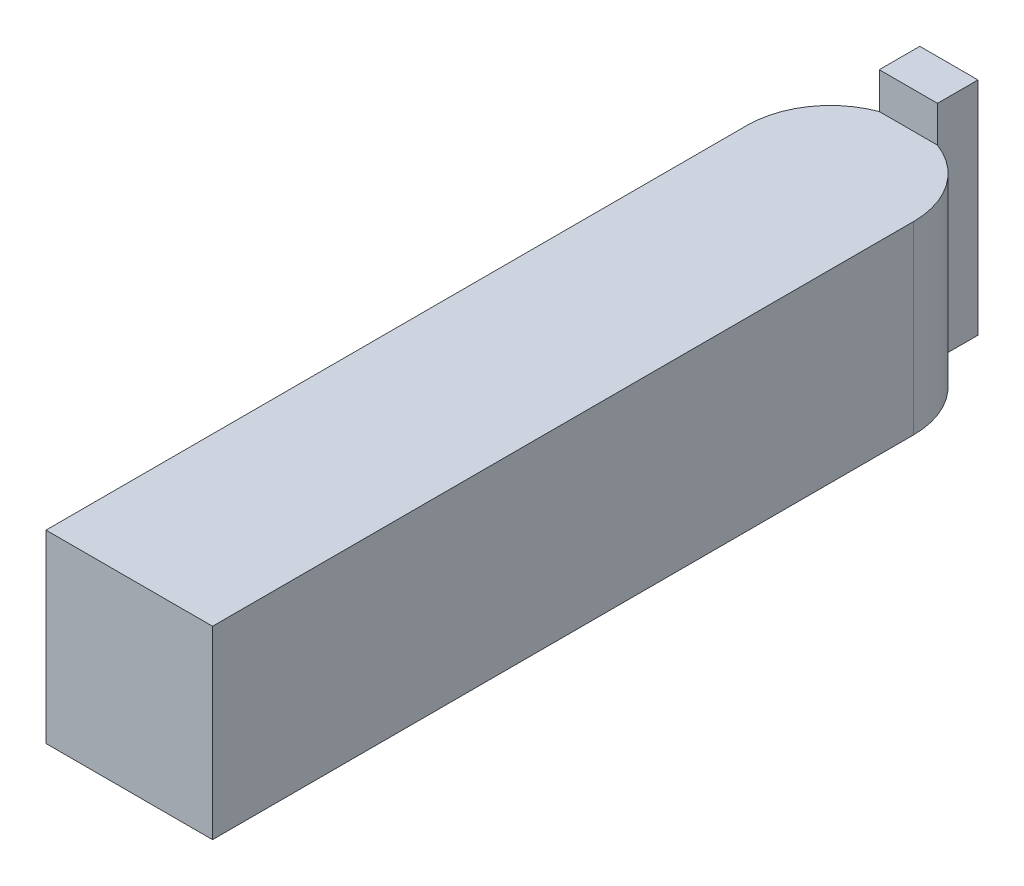
ISO-10303-21;
HEADER;
FILE_DESCRIPTION(('STEP AP214'),'2;1');
FILE_NAME('part.step','',(''),(''),'','','');
FILE_SCHEMA(('AUTOMOTIVE_DESIGN { 1 0 10303 214 1 1 1 1 }'));
ENDSEC;
DATA;
#1=APPLICATION_CONTEXT('core data for automotive mechanical design processes');
#2=APPLICATION_PROTOCOL_DEFINITION('international standard','automotive_design',2000,#1);
#3=PRODUCT_CONTEXT('',#1,'mechanical');
#4=PRODUCT('Part','Part','',(#3));
#5=PRODUCT_RELATED_PRODUCT_CATEGORY('part','',(#4));
#6=PRODUCT_DEFINITION_FORMATION('','',#4);
#7=PRODUCT_DEFINITION_CONTEXT('part definition',#1,'design');
#8=PRODUCT_DEFINITION('design','',#6,#7);
#9=PRODUCT_DEFINITION_SHAPE('','',#8);
#10=(LENGTH_UNIT() NAMED_UNIT(*) SI_UNIT(.MILLI.,.METRE.));
#11=(NAMED_UNIT(*) PLANE_ANGLE_UNIT() SI_UNIT($,.RADIAN.));
#12=(NAMED_UNIT(*) SI_UNIT($,.STERADIAN.) SOLID_ANGLE_UNIT());
#13=UNCERTAINTY_MEASURE_WITH_UNIT(LENGTH_MEASURE(1.E-05),#10,'distance_accuracy_value','');
#14=(GEOMETRIC_REPRESENTATION_CONTEXT(3) GLOBAL_UNCERTAINTY_ASSIGNED_CONTEXT((#13)) GLOBAL_UNIT_ASSIGNED_CONTEXT((#10,
#11,#12)) REPRESENTATION_CONTEXT('',''));
#15=CARTESIAN_POINT('',(0.,0.,0.));
#16=DIRECTION('',(0.,0.,1.));
#17=DIRECTION('',(1.,0.,0.));
#18=AXIS2_PLACEMENT_3D('',#15,#16,#17);
#19=CARTESIAN_POINT('',(0.,36.5125,-69.245));
#20=DIRECTION('',(0.,-1.,0.));
#21=DIRECTION('',(0.,0.,-1.));
#22=AXIS2_PLACEMENT_3D('',#19,#20,#21);
#23=PLANE('',#22);
#24=DIRECTION('',(1.,0.,0.));
#25=VECTOR('',#24,1.);
#26=CARTESIAN_POINT('',(-5.75,36.5125,-84.6573327241531));
#27=LINE('',#26,#25);
#28=CARTESIAN_POINT('',(-5.75,36.5125,-84.6573327241531));
#29=VERTEX_POINT('',#28);
#30=CARTESIAN_POINT('',(5.75,36.5125,-84.6573327241531));
#31=VERTEX_POINT('',#30);
#32=EDGE_CURVE('E210',#29,#31,#27,.T.);
#33=ORIENTED_EDGE('',*,*,#32,.F.);
#34=CARTESIAN_POINT('',(0.,36.5125,-69.245));
#35=DIRECTION('',(0.,1.,0.));
#36=DIRECTION('',(0.,0.,-1.));
#37=AXIS2_PLACEMENT_3D('',#34,#35,#36);
#38=CIRCLE('',#37,16.45);
#39=CARTESIAN_POINT('',(-16.45,36.5125,-69.245));
#40=VERTEX_POINT('',#39);
#41=EDGE_CURVE('E63',#29,#40,#38,.T.);
#42=ORIENTED_EDGE('',*,*,#41,.T.);
#43=DIRECTION('',(0.,0.,1.));
#44=VECTOR('',#43,1.);
#45=CARTESIAN_POINT('',(-16.45,36.5125,69.245));
#46=LINE('',#45,#44);
#47=CARTESIAN_POINT('',(-16.45,36.5125,69.245));
#48=VERTEX_POINT('',#47);
#49=EDGE_CURVE('E167',#40,#48,#46,.T.);
#50=ORIENTED_EDGE('',*,*,#49,.T.);
#51=DIRECTION('',(1.,0.,0.));
#52=VECTOR('',#51,1.);
#53=CARTESIAN_POINT('',(-16.45,36.5125,69.245));
#54=LINE('',#53,#52);
#55=CARTESIAN_POINT('',(16.45,36.5125,69.245));
#56=VERTEX_POINT('',#55);
#57=EDGE_CURVE('E107',#48,#56,#54,.T.);
#58=ORIENTED_EDGE('',*,*,#57,.T.);
#59=DIRECTION('',(0.,0.,-1.));
#60=VECTOR('',#59,1.);
#61=CARTESIAN_POINT('',(16.45,36.5125,69.245));
#62=LINE('',#61,#60);
#63=CARTESIAN_POINT('',(16.45,36.5125,-69.245));
#64=VERTEX_POINT('',#63);
#65=EDGE_CURVE('E115',#56,#64,#62,.T.);
#66=ORIENTED_EDGE('',*,*,#65,.T.);
#67=CARTESIAN_POINT('',(0.,36.5125,-69.245));
#68=DIRECTION('',(0.,1.,0.));
#69=DIRECTION('',(0.,0.,-1.));
#70=AXIS2_PLACEMENT_3D('',#67,#68,#69);
#71=CIRCLE('',#70,16.45);
#72=EDGE_CURVE('E118',#64,#31,#71,.T.);
#73=ORIENTED_EDGE('',*,*,#72,.T.);
#74=EDGE_LOOP('',(#33,#42,#50,#58,#66,#73));
#75=FACE_BOUND('',#74,.T.);
#76=ADVANCED_FACE('F45',(#75),#23,.F.);
#77=CARTESIAN_POINT('',(-16.45,36.5125,69.245));
#78=DIRECTION('',(1.,0.,0.));
#79=DIRECTION('',(0.,0.,-1.));
#80=AXIS2_PLACEMENT_3D('',#77,#78,#79);
#81=PLANE('',#80);
#82=DIRECTION('',(0.,0.,1.));
#83=VECTOR('',#82,1.);
#84=CARTESIAN_POINT('',(-16.45,0.,69.245));
#85=LINE('',#84,#83);
#86=CARTESIAN_POINT('',(-16.45,0.,-69.245));
#87=VERTEX_POINT('',#86);
#88=CARTESIAN_POINT('',(-16.45,0.,69.245));
#89=VERTEX_POINT('',#88);
#90=EDGE_CURVE('E144',#87,#89,#85,.T.);
#91=ORIENTED_EDGE('',*,*,#90,.T.);
#92=DIRECTION('',(0.,-1.,0.));
#93=VECTOR('',#92,1.);
#94=CARTESIAN_POINT('',(-16.45,36.5125,69.245));
#95=LINE('',#94,#93);
#96=EDGE_CURVE('E11',#48,#89,#95,.T.);
#97=ORIENTED_EDGE('',*,*,#96,.F.);
#98=ORIENTED_EDGE('',*,*,#49,.F.);
#99=DIRECTION('',(0.,-1.,0.));
#100=VECTOR('',#99,1.);
#101=CARTESIAN_POINT('',(-16.45,36.5125,-69.245));
#102=LINE('',#101,#100);
#103=EDGE_CURVE('E140',#40,#87,#102,.T.);
#104=ORIENTED_EDGE('',*,*,#103,.T.);
#105=EDGE_LOOP('',(#91,#97,#98,#104));
#106=FACE_BOUND('',#105,.T.);
#107=ADVANCED_FACE('F47',(#106),#81,.F.);
#108=CARTESIAN_POINT('',(-16.45,36.5125,69.245));
#109=DIRECTION('',(0.,0.,-1.));
#110=DIRECTION('',(-1.,0.,0.));
#111=AXIS2_PLACEMENT_3D('',#108,#109,#110);
#112=PLANE('',#111);
#113=DIRECTION('',(1.,0.,0.));
#114=VECTOR('',#113,1.);
#115=CARTESIAN_POINT('',(-16.45,0.,69.245));
#116=LINE('',#115,#114);
#117=CARTESIAN_POINT('',(16.45,0.,69.245));
#118=VERTEX_POINT('',#117);
#119=EDGE_CURVE('E148',#89,#118,#116,.T.);
#120=ORIENTED_EDGE('',*,*,#119,.T.);
#121=DIRECTION('',(0.,-1.,0.));
#122=VECTOR('',#121,1.);
#123=CARTESIAN_POINT('',(16.45,36.5125,69.245));
#124=LINE('',#123,#122);
#125=EDGE_CURVE('E55',#56,#118,#124,.T.);
#126=ORIENTED_EDGE('',*,*,#125,.F.);
#127=ORIENTED_EDGE('',*,*,#57,.F.);
#128=ORIENTED_EDGE('',*,*,#96,.T.);
#129=EDGE_LOOP('',(#120,#126,#127,#128));
#130=FACE_BOUND('',#129,.T.);
#131=ADVANCED_FACE('F217',(#130),#112,.F.);
#132=CARTESIAN_POINT('',(16.45,36.5125,69.245));
#133=DIRECTION('',(-1.,0.,0.));
#134=DIRECTION('',(0.,0.,1.));
#135=AXIS2_PLACEMENT_3D('',#132,#133,#134);
#136=PLANE('',#135);
#137=DIRECTION('',(0.,0.,-1.));
#138=VECTOR('',#137,1.);
#139=CARTESIAN_POINT('',(16.45,0.,69.245));
#140=LINE('',#139,#138);
#141=CARTESIAN_POINT('',(16.45,0.,-69.245));
#142=VERTEX_POINT('',#141);
#143=EDGE_CURVE('E128',#118,#142,#140,.T.);
#144=ORIENTED_EDGE('',*,*,#143,.T.);
#145=DIRECTION('',(0.,-1.,0.));
#146=VECTOR('',#145,1.);
#147=CARTESIAN_POINT('',(16.45,36.5125,-69.245));
#148=LINE('',#147,#146);
#149=EDGE_CURVE('E125',#64,#142,#148,.T.);
#150=ORIENTED_EDGE('',*,*,#149,.F.);
#151=ORIENTED_EDGE('',*,*,#65,.F.);
#152=ORIENTED_EDGE('',*,*,#125,.T.);
#153=EDGE_LOOP('',(#144,#150,#151,#152));
#154=FACE_BOUND('',#153,.T.);
#155=ADVANCED_FACE('F126',(#154),#136,.F.);
#156=CARTESIAN_POINT('',(0.,36.5125,-69.245));
#157=DIRECTION('',(0.,-1.,0.));
#158=DIRECTION('',(0.,0.,-1.));
#159=AXIS2_PLACEMENT_3D('',#156,#157,#158);
#160=CYLINDRICAL_SURFACE('',#159,16.45);
#161=CARTESIAN_POINT('',(0.,0.,-69.245));
#162=DIRECTION('',(0.,1.,0.));
#163=DIRECTION('',(0.,0.,-1.));
#164=AXIS2_PLACEMENT_3D('',#161,#162,#163);
#165=CIRCLE('',#164,16.45);
#166=CARTESIAN_POINT('',(5.75,0.,-84.6573327241531));
#167=VERTEX_POINT('',#166);
#168=EDGE_CURVE('E154',#142,#167,#165,.T.);
#169=ORIENTED_EDGE('',*,*,#168,.T.);
#170=DIRECTION('',(0.,-1.,0.));
#171=VECTOR('',#170,1.);
#172=CARTESIAN_POINT('',(5.75,36.5125,-84.6573327241531));
#173=LINE('',#172,#171);
#174=EDGE_CURVE('E132',#31,#167,#173,.T.);
#175=ORIENTED_EDGE('',*,*,#174,.F.);
#176=ORIENTED_EDGE('',*,*,#72,.F.);
#177=ORIENTED_EDGE('',*,*,#149,.T.);
#178=EDGE_LOOP('',(#169,#175,#176,#177));
#179=FACE_BOUND('',#178,.T.);
#180=ADVANCED_FACE('F135',(#179),#160,.T.);
#181=CARTESIAN_POINT('',(5.75,36.5125,-92.6573327241531));
#182=DIRECTION('',(-1.,0.,0.));
#183=DIRECTION('',(0.,0.,1.));
#184=AXIS2_PLACEMENT_3D('',#181,#182,#183);
#185=PLANE('',#184);
#186=DIRECTION('',(0.,0.,-1.));
#187=VECTOR('',#186,1.);
#188=CARTESIAN_POINT('',(5.75,0.,-92.6573327241531));
#189=LINE('',#188,#187);
#190=CARTESIAN_POINT('',(5.75,0.,-92.6573327241531));
#191=VERTEX_POINT('',#190);
#192=EDGE_CURVE('E157',#167,#191,#189,.T.);
#193=ORIENTED_EDGE('',*,*,#192,.T.);
#194=DIRECTION('',(0.,-1.,0.));
#195=VECTOR('',#194,1.);
#196=CARTESIAN_POINT('',(5.75,36.5125,-92.6573327241531));
#197=LINE('',#196,#195);
#198=CARTESIAN_POINT('',(5.75,43.6725,-92.6573327241531));
#199=VERTEX_POINT('',#198);
#200=EDGE_CURVE('E176',#199,#191,#197,.T.);
#201=ORIENTED_EDGE('',*,*,#200,.F.);
#202=DIRECTION('',(0.,0.,-1.));
#203=VECTOR('',#202,1.);
#204=CARTESIAN_POINT('',(5.75,43.6725,-84.6573327241531));
#205=LINE('',#204,#203);
#206=CARTESIAN_POINT('',(5.75,43.6725,-84.6573327241531));
#207=VERTEX_POINT('',#206);
#208=EDGE_CURVE('E196',#207,#199,#205,.T.);
#209=ORIENTED_EDGE('',*,*,#208,.F.);
#210=DIRECTION('',(0.,-1.,0.));
#211=VECTOR('',#210,1.);
#212=CARTESIAN_POINT('',(5.75,43.6725,-84.6573327241531));
#213=LINE('',#212,#211);
#214=EDGE_CURVE('E193',#207,#31,#213,.T.);
#215=ORIENTED_EDGE('',*,*,#214,.T.);
#216=ORIENTED_EDGE('',*,*,#174,.T.);
#217=EDGE_LOOP('',(#193,#201,#209,#215,#216));
#218=FACE_BOUND('',#217,.T.);
#219=ADVANCED_FACE('F189',(#218),#185,.F.);
#220=CARTESIAN_POINT('',(-5.75,36.5125,-92.6573327241531));
#221=DIRECTION('',(0.,0.,1.));
#222=DIRECTION('',(1.,0.,0.));
#223=AXIS2_PLACEMENT_3D('',#220,#221,#222);
#224=PLANE('',#223);
#225=DIRECTION('',(-1.,0.,0.));
#226=VECTOR('',#225,1.);
#227=CARTESIAN_POINT('',(-5.75,0.,-92.6573327241531));
#228=LINE('',#227,#226);
#229=CARTESIAN_POINT('',(-5.75,0.,-92.6573327241531));
#230=VERTEX_POINT('',#229);
#231=EDGE_CURVE('E160',#191,#230,#228,.T.);
#232=ORIENTED_EDGE('',*,*,#231,.T.);
#233=DIRECTION('',(0.,-1.,0.));
#234=VECTOR('',#233,1.);
#235=CARTESIAN_POINT('',(-5.75,36.5125,-92.6573327241531));
#236=LINE('',#235,#234);
#237=CARTESIAN_POINT('',(-5.75,43.6725,-92.6573327241531));
#238=VERTEX_POINT('',#237);
#239=EDGE_CURVE('E173',#238,#230,#236,.T.);
#240=ORIENTED_EDGE('',*,*,#239,.F.);
#241=DIRECTION('',(-1.,0.,0.));
#242=VECTOR('',#241,1.);
#243=CARTESIAN_POINT('',(5.75,43.6725,-92.6573327241531));
#244=LINE('',#243,#242);
#245=EDGE_CURVE('E201',#199,#238,#244,.T.);
#246=ORIENTED_EDGE('',*,*,#245,.F.);
#247=ORIENTED_EDGE('',*,*,#200,.T.);
#248=EDGE_LOOP('',(#232,#240,#246,#247));
#249=FACE_BOUND('',#248,.T.);
#250=ADVANCED_FACE('F241',(#249),#224,.F.);
#251=CARTESIAN_POINT('',(-5.75,36.5125,-84.6573327241531));
#252=DIRECTION('',(1.,0.,0.));
#253=DIRECTION('',(0.,0.,-1.));
#254=AXIS2_PLACEMENT_3D('',#251,#252,#253);
#255=PLANE('',#254);
#256=DIRECTION('',(0.,0.,1.));
#257=VECTOR('',#256,1.);
#258=CARTESIAN_POINT('',(-5.75,0.,-84.6573327241531));
#259=LINE('',#258,#257);
#260=CARTESIAN_POINT('',(-5.75,0.,-84.6573327241531));
#261=VERTEX_POINT('',#260);
#262=EDGE_CURVE('E93',#230,#261,#259,.T.);
#263=ORIENTED_EDGE('',*,*,#262,.T.);
#264=DIRECTION('',(0.,-1.,0.));
#265=VECTOR('',#264,1.);
#266=CARTESIAN_POINT('',(-5.75,36.5125,-84.6573327241531));
#267=LINE('',#266,#265);
#268=EDGE_CURVE('E170',#29,#261,#267,.T.);
#269=ORIENTED_EDGE('',*,*,#268,.F.);
#270=DIRECTION('',(0.,-1.,0.));
#271=VECTOR('',#270,1.);
#272=CARTESIAN_POINT('',(-5.75,43.6725,-84.6573327241531));
#273=LINE('',#272,#271);
#274=CARTESIAN_POINT('',(-5.75,43.6725,-84.6573327241531));
#275=VERTEX_POINT('',#274);
#276=EDGE_CURVE('E149',#275,#29,#273,.T.);
#277=ORIENTED_EDGE('',*,*,#276,.F.);
#278=DIRECTION('',(0.,0.,1.));
#279=VECTOR('',#278,1.);
#280=CARTESIAN_POINT('',(-5.75,43.6725,-92.6573327241531));
#281=LINE('',#280,#279);
#282=EDGE_CURVE('E311',#238,#275,#281,.T.);
#283=ORIENTED_EDGE('',*,*,#282,.F.);
#284=ORIENTED_EDGE('',*,*,#239,.T.);
#285=EDGE_LOOP('',(#263,#269,#277,#283,#284));
#286=FACE_BOUND('',#285,.T.);
#287=ADVANCED_FACE('F238',(#286),#255,.F.);
#288=CARTESIAN_POINT('',(0.,36.5125,-69.245));
#289=DIRECTION('',(0.,-1.,0.));
#290=DIRECTION('',(0.,0.,-1.));
#291=AXIS2_PLACEMENT_3D('',#288,#289,#290);
#292=CYLINDRICAL_SURFACE('',#291,16.45);
#293=CARTESIAN_POINT('',(0.,0.,-69.245));
#294=DIRECTION('',(0.,1.,0.));
#295=DIRECTION('',(0.,0.,-1.));
#296=AXIS2_PLACEMENT_3D('',#293,#294,#295);
#297=CIRCLE('',#296,16.45);
#298=EDGE_CURVE('E99',#261,#87,#297,.T.);
#299=ORIENTED_EDGE('',*,*,#298,.T.);
#300=ORIENTED_EDGE('',*,*,#103,.F.);
#301=ORIENTED_EDGE('',*,*,#41,.F.);
#302=ORIENTED_EDGE('',*,*,#268,.T.);
#303=EDGE_LOOP('',(#299,#300,#301,#302));
#304=FACE_BOUND('',#303,.T.);
#305=ADVANCED_FACE('F235',(#304),#292,.T.);
#306=CARTESIAN_POINT('',(0.,0.,-69.245));
#307=DIRECTION('',(0.,-1.,0.));
#308=DIRECTION('',(0.,0.,-1.));
#309=AXIS2_PLACEMENT_3D('',#306,#307,#308);
#310=PLANE('',#309);
#311=ORIENTED_EDGE('',*,*,#90,.F.);
#312=ORIENTED_EDGE('',*,*,#298,.F.);
#313=ORIENTED_EDGE('',*,*,#262,.F.);
#314=ORIENTED_EDGE('',*,*,#231,.F.);
#315=ORIENTED_EDGE('',*,*,#192,.F.);
#316=ORIENTED_EDGE('',*,*,#168,.F.);
#317=ORIENTED_EDGE('',*,*,#143,.F.);
#318=ORIENTED_EDGE('',*,*,#119,.F.);
#319=EDGE_LOOP('',(#311,#312,#313,#314,#315,#316,#317,#318));
#320=FACE_BOUND('',#319,.T.);
#321=ADVANCED_FACE('F184',(#320),#310,.T.);
#322=CARTESIAN_POINT('',(-5.75,43.6725,-84.6573327241531));
#323=DIRECTION('',(0.,0.,-1.));
#324=DIRECTION('',(-1.,0.,0.));
#325=AXIS2_PLACEMENT_3D('',#322,#323,#324);
#326=PLANE('',#325);
#327=ORIENTED_EDGE('',*,*,#32,.T.);
#328=ORIENTED_EDGE('',*,*,#214,.F.);
#329=DIRECTION('',(1.,0.,0.));
#330=VECTOR('',#329,1.);
#331=CARTESIAN_POINT('',(-5.75,43.6725,-84.6573327241531));
#332=LINE('',#331,#330);
#333=EDGE_CURVE('E313',#275,#207,#332,.T.);
#334=ORIENTED_EDGE('',*,*,#333,.F.);
#335=ORIENTED_EDGE('',*,*,#276,.T.);
#336=EDGE_LOOP('',(#327,#328,#334,#335));
#337=FACE_BOUND('',#336,.T.);
#338=ADVANCED_FACE('F232',(#337),#326,.F.);
#339=CARTESIAN_POINT('',(0.,43.6725,0.));
#340=DIRECTION('',(0.,1.,0.));
#341=DIRECTION('',(0.,0.,1.));
#342=AXIS2_PLACEMENT_3D('',#339,#340,#341);
#343=PLANE('',#342);
#344=ORIENTED_EDGE('',*,*,#282,.T.);
#345=ORIENTED_EDGE('',*,*,#333,.T.);
#346=ORIENTED_EDGE('',*,*,#208,.T.);
#347=ORIENTED_EDGE('',*,*,#245,.T.);
#348=EDGE_LOOP('',(#344,#345,#346,#347));
#349=FACE_BOUND('',#348,.T.);
#350=ADVANCED_FACE('F298',(#349),#343,.T.);
#351=CLOSED_SHELL('',(#76,#107,#131,#155,#180,#219,#250,#287,#305,#321,#338,#350));
#352=MANIFOLD_SOLID_BREP('B2',#351);
#353=ADVANCED_BREP_SHAPE_REPRESENTATION('',(#18,#352),#14);
#354=SHAPE_DEFINITION_REPRESENTATION(#9,#353);
ENDSEC;
END-ISO-10303-21;
